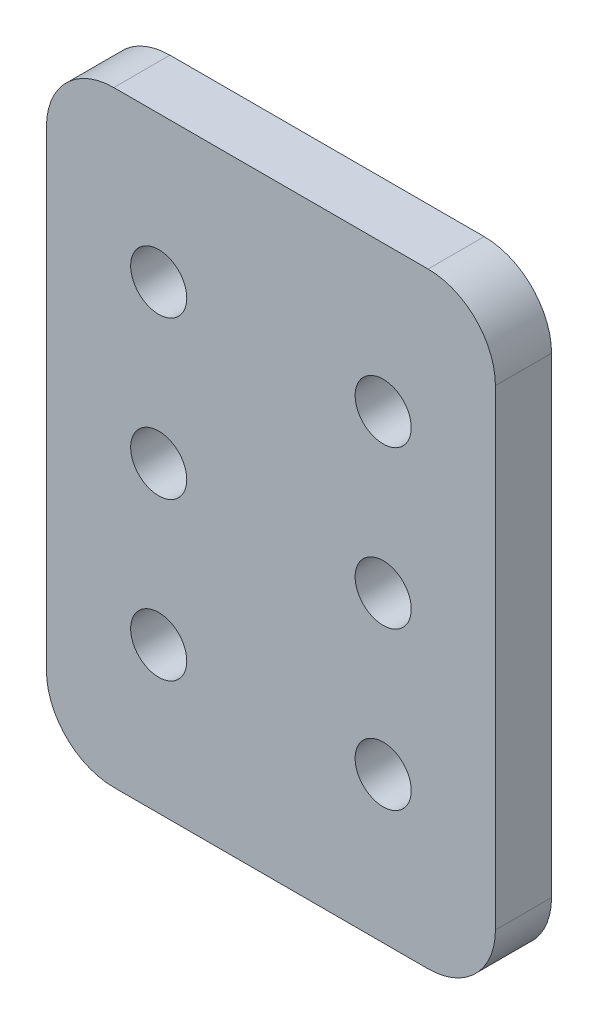
ISO-10303-21;
HEADER;
FILE_DESCRIPTION(('STEP AP214'),'2;1');
FILE_NAME('part.step','',(''),(''),'','','');
FILE_SCHEMA(('AUTOMOTIVE_DESIGN { 1 0 10303 214 1 1 1 1 }'));
ENDSEC;
DATA;
#1=APPLICATION_CONTEXT('core data for automotive mechanical design processes');
#2=APPLICATION_PROTOCOL_DEFINITION('international standard','automotive_design',2000,#1);
#3=PRODUCT_CONTEXT('',#1,'mechanical');
#4=PRODUCT('Part','Part','',(#3));
#5=PRODUCT_RELATED_PRODUCT_CATEGORY('part','',(#4));
#6=PRODUCT_DEFINITION_FORMATION('','',#4);
#7=PRODUCT_DEFINITION_CONTEXT('part definition',#1,'design');
#8=PRODUCT_DEFINITION('design','',#6,#7);
#9=PRODUCT_DEFINITION_SHAPE('','',#8);
#10=(LENGTH_UNIT() NAMED_UNIT(*) SI_UNIT(.MILLI.,.METRE.));
#11=(NAMED_UNIT(*) PLANE_ANGLE_UNIT() SI_UNIT($,.RADIAN.));
#12=(NAMED_UNIT(*) SI_UNIT($,.STERADIAN.) SOLID_ANGLE_UNIT());
#13=UNCERTAINTY_MEASURE_WITH_UNIT(LENGTH_MEASURE(1.E-05),#10,'distance_accuracy_value','');
#14=(GEOMETRIC_REPRESENTATION_CONTEXT(3) GLOBAL_UNCERTAINTY_ASSIGNED_CONTEXT((#13)) GLOBAL_UNIT_ASSIGNED_CONTEXT((#10,
#11,#12)) REPRESENTATION_CONTEXT('',''));
#15=CARTESIAN_POINT('',(0.,0.,0.));
#16=DIRECTION('',(0.,0.,1.));
#17=DIRECTION('',(1.,0.,0.));
#18=AXIS2_PLACEMENT_3D('',#15,#16,#17);
#19=CARTESIAN_POINT('',(25.4,34.29,6.35));
#20=DIRECTION('',(-1.,0.,0.));
#21=DIRECTION('',(0.,-1.,0.));
#22=AXIS2_PLACEMENT_3D('',#19,#20,#21);
#23=PLANE('',#22);
#24=DIRECTION('',(0.,1.,0.));
#25=VECTOR('',#24,1.);
#26=CARTESIAN_POINT('',(25.4,34.29,6.35));
#27=LINE('',#26,#25);
#28=CARTESIAN_POINT('',(25.4,-26.67,6.35));
#29=VERTEX_POINT('',#28);
#30=CARTESIAN_POINT('',(25.4,26.67,6.35));
#31=VERTEX_POINT('',#30);
#32=EDGE_CURVE('E142',#29,#31,#27,.T.);
#33=ORIENTED_EDGE('',*,*,#32,.F.);
#34=DIRECTION('',(0.,0.,-1.));
#35=VECTOR('',#34,1.);
#36=CARTESIAN_POINT('',(25.4,-26.67,6.35));
#37=LINE('',#36,#35);
#38=CARTESIAN_POINT('',(25.4,-26.67,0.));
#39=VERTEX_POINT('',#38);
#40=EDGE_CURVE('E181',#29,#39,#37,.T.);
#41=ORIENTED_EDGE('',*,*,#40,.T.);
#42=DIRECTION('',(0.,1.,0.));
#43=VECTOR('',#42,1.);
#44=CARTESIAN_POINT('',(25.4,34.29,0.));
#45=LINE('',#44,#43);
#46=CARTESIAN_POINT('',(25.4,26.67,0.));
#47=VERTEX_POINT('',#46);
#48=EDGE_CURVE('E192',#39,#47,#45,.T.);
#49=ORIENTED_EDGE('',*,*,#48,.T.);
#50=DIRECTION('',(0.,0.,-1.));
#51=VECTOR('',#50,1.);
#52=CARTESIAN_POINT('',(25.4,26.67,6.35));
#53=LINE('',#52,#51);
#54=EDGE_CURVE('E178',#47,#31,#53,.F.);
#55=ORIENTED_EDGE('',*,*,#54,.T.);
#56=EDGE_LOOP('',(#33,#41,#49,#55));
#57=FACE_BOUND('',#56,.T.);
#58=ADVANCED_FACE('F47',(#57),#23,.F.);
#59=CARTESIAN_POINT('',(-25.4,34.29,6.35));
#60=DIRECTION('',(0.,-1.,0.));
#61=DIRECTION('',(0.,0.,-1.));
#62=AXIS2_PLACEMENT_3D('',#59,#60,#61);
#63=PLANE('',#62);
#64=DIRECTION('',(-1.,0.,0.));
#65=VECTOR('',#64,1.);
#66=CARTESIAN_POINT('',(-25.4,34.29,0.));
#67=LINE('',#66,#65);
#68=CARTESIAN_POINT('',(17.78,34.29,0.));
#69=VERTEX_POINT('',#68);
#70=CARTESIAN_POINT('',(-17.78,34.29,0.));
#71=VERTEX_POINT('',#70);
#72=EDGE_CURVE('E149',#69,#71,#67,.T.);
#73=ORIENTED_EDGE('',*,*,#72,.T.);
#74=DIRECTION('',(0.,0.,-1.));
#75=VECTOR('',#74,1.);
#76=CARTESIAN_POINT('',(-17.78,34.29,6.35));
#77=LINE('',#76,#75);
#78=CARTESIAN_POINT('',(-17.78,34.29,6.35));
#79=VERTEX_POINT('',#78);
#80=EDGE_CURVE('E11',#71,#79,#77,.F.);
#81=ORIENTED_EDGE('',*,*,#80,.T.);
#82=DIRECTION('',(-1.,0.,0.));
#83=VECTOR('',#82,1.);
#84=CARTESIAN_POINT('',(-25.4,34.29,6.35));
#85=LINE('',#84,#83);
#86=CARTESIAN_POINT('',(17.78,34.29,6.35));
#87=VERTEX_POINT('',#86);
#88=EDGE_CURVE('E147',#87,#79,#85,.T.);
#89=ORIENTED_EDGE('',*,*,#88,.F.);
#90=DIRECTION('',(0.,0.,-1.));
#91=VECTOR('',#90,1.);
#92=CARTESIAN_POINT('',(17.78,34.29,6.35));
#93=LINE('',#92,#91);
#94=EDGE_CURVE('E56',#87,#69,#93,.T.);
#95=ORIENTED_EDGE('',*,*,#94,.T.);
#96=EDGE_LOOP('',(#73,#81,#89,#95));
#97=FACE_BOUND('',#96,.T.);
#98=ADVANCED_FACE('F188',(#97),#63,.F.);
#99=CARTESIAN_POINT('',(-25.4,34.29,6.35));
#100=DIRECTION('',(1.,0.,0.));
#101=DIRECTION('',(0.,1.,0.));
#102=AXIS2_PLACEMENT_3D('',#99,#100,#101);
#103=PLANE('',#102);
#104=DIRECTION('',(0.,-1.,0.));
#105=VECTOR('',#104,1.);
#106=CARTESIAN_POINT('',(-25.4,34.29,0.));
#107=LINE('',#106,#105);
#108=CARTESIAN_POINT('',(-25.4,26.67,0.));
#109=VERTEX_POINT('',#108);
#110=CARTESIAN_POINT('',(-25.4,-26.67,0.));
#111=VERTEX_POINT('',#110);
#112=EDGE_CURVE('E143',#109,#111,#107,.T.);
#113=ORIENTED_EDGE('',*,*,#112,.T.);
#114=DIRECTION('',(0.,0.,-1.));
#115=VECTOR('',#114,1.);
#116=CARTESIAN_POINT('',(-25.4,-26.67,6.35));
#117=LINE('',#116,#115);
#118=CARTESIAN_POINT('',(-25.4,-26.67,6.35));
#119=VERTEX_POINT('',#118);
#120=EDGE_CURVE('E118',#111,#119,#117,.F.);
#121=ORIENTED_EDGE('',*,*,#120,.T.);
#122=DIRECTION('',(0.,-1.,0.));
#123=VECTOR('',#122,1.);
#124=CARTESIAN_POINT('',(-25.4,34.29,6.35));
#125=LINE('',#124,#123);
#126=CARTESIAN_POINT('',(-25.4,26.67,6.35));
#127=VERTEX_POINT('',#126);
#128=EDGE_CURVE('E199',#127,#119,#125,.T.);
#129=ORIENTED_EDGE('',*,*,#128,.F.);
#130=DIRECTION('',(0.,0.,-1.));
#131=VECTOR('',#130,1.);
#132=CARTESIAN_POINT('',(-25.4,26.67,6.35));
#133=LINE('',#132,#131);
#134=EDGE_CURVE('E124',#127,#109,#133,.T.);
#135=ORIENTED_EDGE('',*,*,#134,.T.);
#136=EDGE_LOOP('',(#113,#121,#129,#135));
#137=FACE_BOUND('',#136,.T.);
#138=ADVANCED_FACE('F279',(#137),#103,.F.);
#139=CARTESIAN_POINT('',(-25.4,-34.29,6.35));
#140=DIRECTION('',(0.,1.,0.));
#141=DIRECTION('',(0.,0.,1.));
#142=AXIS2_PLACEMENT_3D('',#139,#140,#141);
#143=PLANE('',#142);
#144=DIRECTION('',(1.,0.,0.));
#145=VECTOR('',#144,1.);
#146=CARTESIAN_POINT('',(-25.4,-34.29,6.35));
#147=LINE('',#146,#145);
#148=CARTESIAN_POINT('',(-17.78,-34.29,6.35));
#149=VERTEX_POINT('',#148);
#150=CARTESIAN_POINT('',(17.78,-34.29,6.35));
#151=VERTEX_POINT('',#150);
#152=EDGE_CURVE('E134',#149,#151,#147,.T.);
#153=ORIENTED_EDGE('',*,*,#152,.F.);
#154=DIRECTION('',(0.,0.,-1.));
#155=VECTOR('',#154,1.);
#156=CARTESIAN_POINT('',(-17.78,-34.29,6.35));
#157=LINE('',#156,#155);
#158=CARTESIAN_POINT('',(-17.78,-34.29,0.));
#159=VERTEX_POINT('',#158);
#160=EDGE_CURVE('E117',#149,#159,#157,.T.);
#161=ORIENTED_EDGE('',*,*,#160,.T.);
#162=DIRECTION('',(1.,0.,0.));
#163=VECTOR('',#162,1.);
#164=CARTESIAN_POINT('',(-25.4,-34.29,0.));
#165=LINE('',#164,#163);
#166=CARTESIAN_POINT('',(17.78,-34.29,0.));
#167=VERTEX_POINT('',#166);
#168=EDGE_CURVE('E131',#159,#167,#165,.T.);
#169=ORIENTED_EDGE('',*,*,#168,.T.);
#170=DIRECTION('',(0.,0.,-1.));
#171=VECTOR('',#170,1.);
#172=CARTESIAN_POINT('',(17.78,-34.29,6.35));
#173=LINE('',#172,#171);
#174=EDGE_CURVE('E137',#167,#151,#173,.F.);
#175=ORIENTED_EDGE('',*,*,#174,.T.);
#176=EDGE_LOOP('',(#153,#161,#169,#175));
#177=FACE_BOUND('',#176,.T.);
#178=ADVANCED_FACE('F130',(#177),#143,.F.);
#179=CARTESIAN_POINT('',(0.,0.,6.35));
#180=DIRECTION('',(0.,0.,1.));
#181=DIRECTION('',(1.,0.,0.));
#182=AXIS2_PLACEMENT_3D('',#179,#180,#181);
#183=PLANE('',#182);
#184=CARTESIAN_POINT('',(12.7,-17.78,6.35));
#185=DIRECTION('',(0.,0.,1.));
#186=DIRECTION('',(1.,0.,0.));
#187=AXIS2_PLACEMENT_3D('',#184,#185,#186);
#188=CIRCLE('',#187,3.17500000000001);
#189=CARTESIAN_POINT('',(15.875,-17.78,6.35));
#190=VERTEX_POINT('',#189);
#191=EDGE_CURVE('E230',#190,#190,#188,.T.);
#192=ORIENTED_EDGE('',*,*,#191,.F.);
#193=EDGE_LOOP('',(#192));
#194=FACE_BOUND('',#193,.T.);
#195=CARTESIAN_POINT('',(12.7,17.78,6.35));
#196=DIRECTION('',(0.,0.,1.));
#197=DIRECTION('',(1.,0.,0.));
#198=AXIS2_PLACEMENT_3D('',#195,#196,#197);
#199=CIRCLE('',#198,3.17500000000001);
#200=CARTESIAN_POINT('',(15.875,17.78,6.35));
#201=VERTEX_POINT('',#200);
#202=EDGE_CURVE('E237',#201,#201,#199,.T.);
#203=ORIENTED_EDGE('',*,*,#202,.F.);
#204=EDGE_LOOP('',(#203));
#205=FACE_BOUND('',#204,.T.);
#206=CARTESIAN_POINT('',(-12.7,-17.78,6.35));
#207=DIRECTION('',(0.,0.,1.));
#208=DIRECTION('',(1.,0.,0.));
#209=AXIS2_PLACEMENT_3D('',#206,#207,#208);
#210=CIRCLE('',#209,3.175);
#211=CARTESIAN_POINT('',(-9.525,-17.78,6.35));
#212=VERTEX_POINT('',#211);
#213=EDGE_CURVE('E210',#212,#212,#210,.T.);
#214=ORIENTED_EDGE('',*,*,#213,.F.);
#215=EDGE_LOOP('',(#214));
#216=FACE_BOUND('',#215,.T.);
#217=CARTESIAN_POINT('',(-12.7,17.78,6.35));
#218=DIRECTION('',(0.,0.,1.));
#219=DIRECTION('',(1.,0.,0.));
#220=AXIS2_PLACEMENT_3D('',#217,#218,#219);
#221=CIRCLE('',#220,3.175);
#222=CARTESIAN_POINT('',(-9.525,17.78,6.35));
#223=VERTEX_POINT('',#222);
#224=EDGE_CURVE('E221',#223,#223,#221,.T.);
#225=ORIENTED_EDGE('',*,*,#224,.F.);
#226=EDGE_LOOP('',(#225));
#227=FACE_BOUND('',#226,.T.);
#228=CARTESIAN_POINT('',(-12.7,0.,6.35));
#229=DIRECTION('',(0.,0.,1.));
#230=DIRECTION('',(1.,0.,0.));
#231=AXIS2_PLACEMENT_3D('',#228,#229,#230);
#232=CIRCLE('',#231,3.175);
#233=CARTESIAN_POINT('',(-9.525,0.,6.35));
#234=VERTEX_POINT('',#233);
#235=EDGE_CURVE('E214',#234,#234,#232,.T.);
#236=ORIENTED_EDGE('',*,*,#235,.F.);
#237=EDGE_LOOP('',(#236));
#238=FACE_BOUND('',#237,.T.);
#239=CARTESIAN_POINT('',(12.7,0.,6.35));
#240=DIRECTION('',(0.,0.,1.));
#241=DIRECTION('',(1.,0.,0.));
#242=AXIS2_PLACEMENT_3D('',#239,#240,#241);
#243=CIRCLE('',#242,3.17500000000001);
#244=CARTESIAN_POINT('',(15.875,0.,6.35));
#245=VERTEX_POINT('',#244);
#246=EDGE_CURVE('E209',#245,#245,#243,.T.);
#247=ORIENTED_EDGE('',*,*,#246,.F.);
#248=EDGE_LOOP('',(#247));
#249=FACE_BOUND('',#248,.T.);
#250=ORIENTED_EDGE('',*,*,#128,.T.);
#251=CARTESIAN_POINT('',(-17.78,-26.67,6.35));
#252=DIRECTION('',(0.,0.,1.));
#253=DIRECTION('',(1.,0.,0.));
#254=AXIS2_PLACEMENT_3D('',#251,#252,#253);
#255=CIRCLE('',#254,7.62);
#256=EDGE_CURVE('E175',#119,#149,#255,.T.);
#257=ORIENTED_EDGE('',*,*,#256,.T.);
#258=ORIENTED_EDGE('',*,*,#152,.T.);
#259=CARTESIAN_POINT('',(17.78,-26.67,6.35));
#260=DIRECTION('',(0.,0.,1.));
#261=DIRECTION('',(1.,0.,0.));
#262=AXIS2_PLACEMENT_3D('',#259,#260,#261);
#263=CIRCLE('',#262,7.62);
#264=EDGE_CURVE('E172',#151,#29,#263,.T.);
#265=ORIENTED_EDGE('',*,*,#264,.T.);
#266=ORIENTED_EDGE('',*,*,#32,.T.);
#267=CARTESIAN_POINT('',(17.78,26.67,6.35));
#268=DIRECTION('',(0.,0.,1.));
#269=DIRECTION('',(1.,0.,0.));
#270=AXIS2_PLACEMENT_3D('',#267,#268,#269);
#271=CIRCLE('',#270,7.62);
#272=EDGE_CURVE('E68',#31,#87,#271,.T.);
#273=ORIENTED_EDGE('',*,*,#272,.T.);
#274=ORIENTED_EDGE('',*,*,#88,.T.);
#275=CARTESIAN_POINT('',(-17.78,26.67,6.35));
#276=DIRECTION('',(0.,0.,1.));
#277=DIRECTION('',(1.,0.,0.));
#278=AXIS2_PLACEMENT_3D('',#275,#276,#277);
#279=CIRCLE('',#278,7.62);
#280=EDGE_CURVE('E169',#79,#127,#279,.T.);
#281=ORIENTED_EDGE('',*,*,#280,.T.);
#282=EDGE_LOOP('',(#250,#257,#258,#265,#266,#273,#274,#281));
#283=FACE_BOUND('',#282,.T.);
#284=ADVANCED_FACE('F262',(#194,#205,#216,#227,#238,#249,#283),#183,.T.);
#285=CARTESIAN_POINT('',(0.,0.,0.));
#286=DIRECTION('',(0.,0.,1.));
#287=DIRECTION('',(1.,0.,0.));
#288=AXIS2_PLACEMENT_3D('',#285,#286,#287);
#289=PLANE('',#288);
#290=CARTESIAN_POINT('',(12.7,-17.78,0.));
#291=DIRECTION('',(0.,0.,1.));
#292=DIRECTION('',(1.,0.,0.));
#293=AXIS2_PLACEMENT_3D('',#290,#291,#292);
#294=CIRCLE('',#293,3.17500000000001);
#295=CARTESIAN_POINT('',(15.875,-17.78,0.));
#296=VERTEX_POINT('',#295);
#297=EDGE_CURVE('E241',#296,#296,#294,.T.);
#298=ORIENTED_EDGE('',*,*,#297,.T.);
#299=EDGE_LOOP('',(#298));
#300=FACE_BOUND('',#299,.T.);
#301=CARTESIAN_POINT('',(12.7,17.78,0.));
#302=DIRECTION('',(0.,0.,1.));
#303=DIRECTION('',(1.,0.,0.));
#304=AXIS2_PLACEMENT_3D('',#301,#302,#303);
#305=CIRCLE('',#304,3.17500000000001);
#306=CARTESIAN_POINT('',(15.875,17.78,0.));
#307=VERTEX_POINT('',#306);
#308=EDGE_CURVE('E242',#307,#307,#305,.T.);
#309=ORIENTED_EDGE('',*,*,#308,.T.);
#310=EDGE_LOOP('',(#309));
#311=FACE_BOUND('',#310,.T.);
#312=CARTESIAN_POINT('',(-12.7,-17.78,0.));
#313=DIRECTION('',(0.,0.,1.));
#314=DIRECTION('',(1.,0.,0.));
#315=AXIS2_PLACEMENT_3D('',#312,#313,#314);
#316=CIRCLE('',#315,3.175);
#317=CARTESIAN_POINT('',(-9.525,-17.78,0.));
#318=VERTEX_POINT('',#317);
#319=EDGE_CURVE('E225',#318,#318,#316,.T.);
#320=ORIENTED_EDGE('',*,*,#319,.T.);
#321=EDGE_LOOP('',(#320));
#322=FACE_BOUND('',#321,.T.);
#323=CARTESIAN_POINT('',(-12.7,17.78,0.));
#324=DIRECTION('',(0.,0.,1.));
#325=DIRECTION('',(1.,0.,0.));
#326=AXIS2_PLACEMENT_3D('',#323,#324,#325);
#327=CIRCLE('',#326,3.175);
#328=CARTESIAN_POINT('',(-9.525,17.78,0.));
#329=VERTEX_POINT('',#328);
#330=EDGE_CURVE('E226',#329,#329,#327,.T.);
#331=ORIENTED_EDGE('',*,*,#330,.T.);
#332=EDGE_LOOP('',(#331));
#333=FACE_BOUND('',#332,.T.);
#334=CARTESIAN_POINT('',(-12.7,0.,0.));
#335=DIRECTION('',(0.,0.,1.));
#336=DIRECTION('',(1.,0.,0.));
#337=AXIS2_PLACEMENT_3D('',#334,#335,#336);
#338=CIRCLE('',#337,3.175);
#339=CARTESIAN_POINT('',(-9.525,0.,0.));
#340=VERTEX_POINT('',#339);
#341=EDGE_CURVE('E194',#340,#340,#338,.T.);
#342=ORIENTED_EDGE('',*,*,#341,.T.);
#343=EDGE_LOOP('',(#342));
#344=FACE_BOUND('',#343,.T.);
#345=CARTESIAN_POINT('',(12.7,0.,0.));
#346=DIRECTION('',(0.,0.,1.));
#347=DIRECTION('',(1.,0.,0.));
#348=AXIS2_PLACEMENT_3D('',#345,#346,#347);
#349=CIRCLE('',#348,3.17500000000001);
#350=CARTESIAN_POINT('',(15.875,0.,0.));
#351=VERTEX_POINT('',#350);
#352=EDGE_CURVE('E205',#351,#351,#349,.T.);
#353=ORIENTED_EDGE('',*,*,#352,.T.);
#354=EDGE_LOOP('',(#353));
#355=FACE_BOUND('',#354,.T.);
#356=ORIENTED_EDGE('',*,*,#168,.F.);
#357=CARTESIAN_POINT('',(-17.78,-26.67,0.));
#358=DIRECTION('',(0.,0.,1.));
#359=DIRECTION('',(1.,0.,0.));
#360=AXIS2_PLACEMENT_3D('',#357,#358,#359);
#361=CIRCLE('',#360,7.62);
#362=EDGE_CURVE('E113',#159,#111,#361,.F.);
#363=ORIENTED_EDGE('',*,*,#362,.T.);
#364=ORIENTED_EDGE('',*,*,#112,.F.);
#365=CARTESIAN_POINT('',(-17.78,26.67,0.));
#366=DIRECTION('',(0.,0.,1.));
#367=DIRECTION('',(1.,0.,0.));
#368=AXIS2_PLACEMENT_3D('',#365,#366,#367);
#369=CIRCLE('',#368,7.62);
#370=EDGE_CURVE('E157',#109,#71,#369,.F.);
#371=ORIENTED_EDGE('',*,*,#370,.T.);
#372=ORIENTED_EDGE('',*,*,#72,.F.);
#373=CARTESIAN_POINT('',(17.78,26.67,0.));
#374=DIRECTION('',(0.,0.,1.));
#375=DIRECTION('',(1.,0.,0.));
#376=AXIS2_PLACEMENT_3D('',#373,#374,#375);
#377=CIRCLE('',#376,7.62);
#378=EDGE_CURVE('E136',#69,#47,#377,.F.);
#379=ORIENTED_EDGE('',*,*,#378,.T.);
#380=ORIENTED_EDGE('',*,*,#48,.F.);
#381=CARTESIAN_POINT('',(17.78,-26.67,0.));
#382=DIRECTION('',(0.,0.,1.));
#383=DIRECTION('',(1.,0.,0.));
#384=AXIS2_PLACEMENT_3D('',#381,#382,#383);
#385=CIRCLE('',#384,7.62);
#386=EDGE_CURVE('E125',#39,#167,#385,.F.);
#387=ORIENTED_EDGE('',*,*,#386,.T.);
#388=EDGE_LOOP('',(#356,#363,#364,#371,#372,#379,#380,#387));
#389=FACE_BOUND('',#388,.T.);
#390=ADVANCED_FACE('F139',(#300,#311,#322,#333,#344,#355,#389),#289,.F.);
#391=CARTESIAN_POINT('',(-17.78,-26.67,6.35));
#392=DIRECTION('',(0.,0.,-1.));
#393=DIRECTION('',(-1.,0.,0.));
#394=AXIS2_PLACEMENT_3D('',#391,#392,#393);
#395=CYLINDRICAL_SURFACE('',#394,7.62);
#396=ORIENTED_EDGE('',*,*,#256,.F.);
#397=ORIENTED_EDGE('',*,*,#120,.F.);
#398=ORIENTED_EDGE('',*,*,#362,.F.);
#399=ORIENTED_EDGE('',*,*,#160,.F.);
#400=EDGE_LOOP('',(#396,#397,#398,#399));
#401=FACE_BOUND('',#400,.T.);
#402=ADVANCED_FACE('F116',(#401),#395,.T.);
#403=CARTESIAN_POINT('',(17.78,-26.67,6.35));
#404=DIRECTION('',(0.,0.,-1.));
#405=DIRECTION('',(-1.,0.,0.));
#406=AXIS2_PLACEMENT_3D('',#403,#404,#405);
#407=CYLINDRICAL_SURFACE('',#406,7.62);
#408=ORIENTED_EDGE('',*,*,#264,.F.);
#409=ORIENTED_EDGE('',*,*,#174,.F.);
#410=ORIENTED_EDGE('',*,*,#386,.F.);
#411=ORIENTED_EDGE('',*,*,#40,.F.);
#412=EDGE_LOOP('',(#408,#409,#410,#411));
#413=FACE_BOUND('',#412,.T.);
#414=ADVANCED_FACE('F283',(#413),#407,.T.);
#415=CARTESIAN_POINT('',(-17.78,26.67,6.35));
#416=DIRECTION('',(0.,0.,-1.));
#417=DIRECTION('',(-1.,0.,0.));
#418=AXIS2_PLACEMENT_3D('',#415,#416,#417);
#419=CYLINDRICAL_SURFACE('',#418,7.62);
#420=ORIENTED_EDGE('',*,*,#280,.F.);
#421=ORIENTED_EDGE('',*,*,#80,.F.);
#422=ORIENTED_EDGE('',*,*,#370,.F.);
#423=ORIENTED_EDGE('',*,*,#134,.F.);
#424=EDGE_LOOP('',(#420,#421,#422,#423));
#425=FACE_BOUND('',#424,.T.);
#426=ADVANCED_FACE('F281',(#425),#419,.T.);
#427=CARTESIAN_POINT('',(17.78,26.67,6.35));
#428=DIRECTION('',(0.,0.,-1.));
#429=DIRECTION('',(-1.,0.,0.));
#430=AXIS2_PLACEMENT_3D('',#427,#428,#429);
#431=CYLINDRICAL_SURFACE('',#430,7.62);
#432=ORIENTED_EDGE('',*,*,#272,.F.);
#433=ORIENTED_EDGE('',*,*,#54,.F.);
#434=ORIENTED_EDGE('',*,*,#378,.F.);
#435=ORIENTED_EDGE('',*,*,#94,.F.);
#436=EDGE_LOOP('',(#432,#433,#434,#435));
#437=FACE_BOUND('',#436,.T.);
#438=ADVANCED_FACE('F49',(#437),#431,.T.);
#439=CARTESIAN_POINT('',(12.7,0.,0.));
#440=DIRECTION('',(0.,0.,1.));
#441=DIRECTION('',(1.,0.,0.));
#442=AXIS2_PLACEMENT_3D('',#439,#440,#441);
#443=CYLINDRICAL_SURFACE('',#442,3.17500000000001);
#444=ORIENTED_EDGE('',*,*,#352,.F.);
#445=EDGE_LOOP('',(#444));
#446=FACE_BOUND('',#445,.T.);
#447=ORIENTED_EDGE('',*,*,#246,.T.);
#448=EDGE_LOOP('',(#447));
#449=FACE_BOUND('',#448,.T.);
#450=ADVANCED_FACE('F288',(#446,#449),#443,.F.);
#451=CARTESIAN_POINT('',(-12.7,0.,0.));
#452=DIRECTION('',(0.,0.,1.));
#453=DIRECTION('',(1.,0.,0.));
#454=AXIS2_PLACEMENT_3D('',#451,#452,#453);
#455=CYLINDRICAL_SURFACE('',#454,3.175);
#456=ORIENTED_EDGE('',*,*,#341,.F.);
#457=EDGE_LOOP('',(#456));
#458=FACE_BOUND('',#457,.T.);
#459=ORIENTED_EDGE('',*,*,#235,.T.);
#460=EDGE_LOOP('',(#459));
#461=FACE_BOUND('',#460,.T.);
#462=ADVANCED_FACE('F362',(#458,#461),#455,.F.);
#463=CARTESIAN_POINT('',(-12.7,17.78,0.));
#464=DIRECTION('',(0.,0.,1.));
#465=DIRECTION('',(1.,0.,0.));
#466=AXIS2_PLACEMENT_3D('',#463,#464,#465);
#467=CYLINDRICAL_SURFACE('',#466,3.175);
#468=ORIENTED_EDGE('',*,*,#330,.F.);
#469=EDGE_LOOP('',(#468));
#470=FACE_BOUND('',#469,.T.);
#471=ORIENTED_EDGE('',*,*,#224,.T.);
#472=EDGE_LOOP('',(#471));
#473=FACE_BOUND('',#472,.T.);
#474=ADVANCED_FACE('F371',(#470,#473),#467,.F.);
#475=CARTESIAN_POINT('',(-12.7,-17.78,0.));
#476=DIRECTION('',(0.,0.,1.));
#477=DIRECTION('',(1.,0.,0.));
#478=AXIS2_PLACEMENT_3D('',#475,#476,#477);
#479=CYLINDRICAL_SURFACE('',#478,3.175);
#480=ORIENTED_EDGE('',*,*,#319,.F.);
#481=EDGE_LOOP('',(#480));
#482=FACE_BOUND('',#481,.T.);
#483=ORIENTED_EDGE('',*,*,#213,.T.);
#484=EDGE_LOOP('',(#483));
#485=FACE_BOUND('',#484,.T.);
#486=ADVANCED_FACE('F381',(#482,#485),#479,.F.);
#487=CARTESIAN_POINT('',(12.7,17.78,0.));
#488=DIRECTION('',(0.,0.,1.));
#489=DIRECTION('',(1.,0.,0.));
#490=AXIS2_PLACEMENT_3D('',#487,#488,#489);
#491=CYLINDRICAL_SURFACE('',#490,3.17500000000001);
#492=ORIENTED_EDGE('',*,*,#308,.F.);
#493=EDGE_LOOP('',(#492));
#494=FACE_BOUND('',#493,.T.);
#495=ORIENTED_EDGE('',*,*,#202,.T.);
#496=EDGE_LOOP('',(#495));
#497=FACE_BOUND('',#496,.T.);
#498=ADVANCED_FACE('F258',(#494,#497),#491,.F.);
#499=CARTESIAN_POINT('',(12.7,-17.78,0.));
#500=DIRECTION('',(0.,0.,1.));
#501=DIRECTION('',(1.,0.,0.));
#502=AXIS2_PLACEMENT_3D('',#499,#500,#501);
#503=CYLINDRICAL_SURFACE('',#502,3.17500000000001);
#504=ORIENTED_EDGE('',*,*,#297,.F.);
#505=EDGE_LOOP('',(#504));
#506=FACE_BOUND('',#505,.T.);
#507=ORIENTED_EDGE('',*,*,#191,.T.);
#508=EDGE_LOOP('',(#507));
#509=FACE_BOUND('',#508,.T.);
#510=ADVANCED_FACE('F255',(#506,#509),#503,.F.);
#511=CLOSED_SHELL('',(#58,#98,#138,#178,#284,#390,#402,#414,#426,#438,#450,#462,#474,#486,#498,#510));
#512=MANIFOLD_SOLID_BREP('B2',#511);
#513=ADVANCED_BREP_SHAPE_REPRESENTATION('',(#18,#512),#14);
#514=SHAPE_DEFINITION_REPRESENTATION(#9,#513);
ENDSEC;
END-ISO-10303-21;
